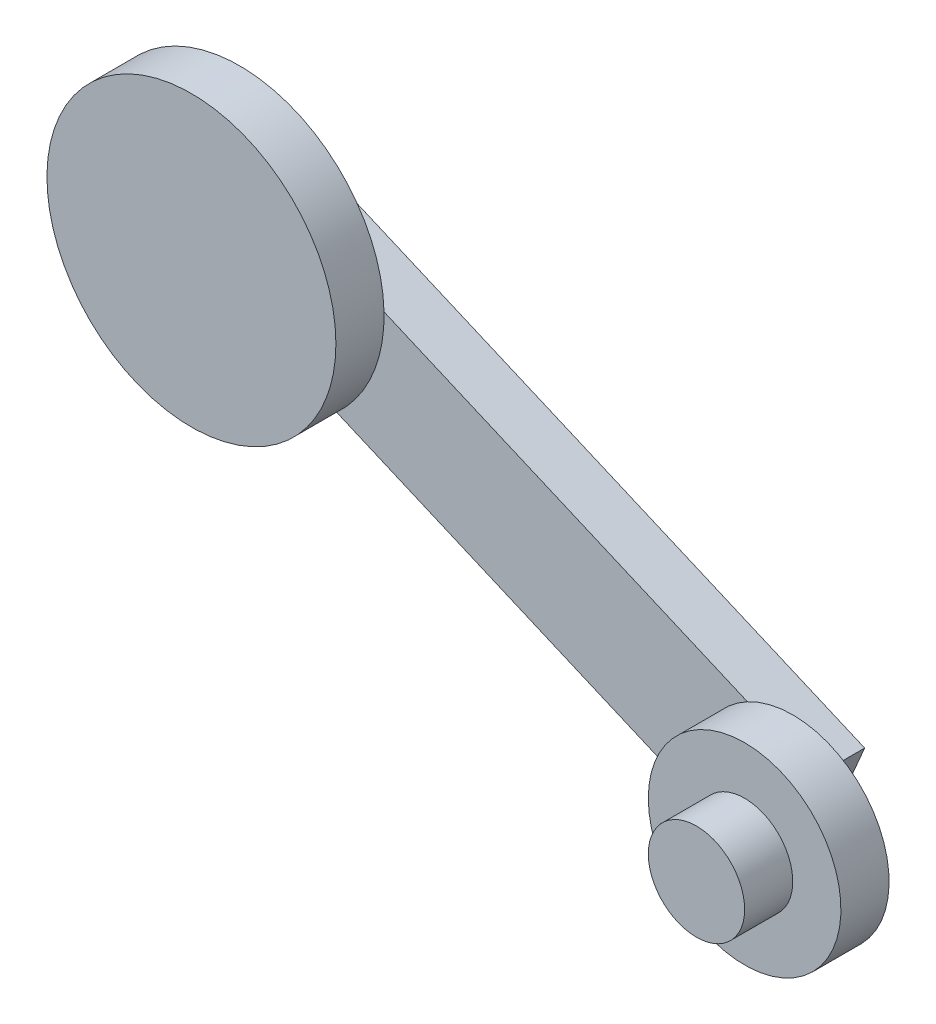
ISO-10303-21;
HEADER;
FILE_DESCRIPTION(('STEP AP214'),'2;1');
FILE_NAME('part.step','',(''),(''),'','','');
FILE_SCHEMA(('AUTOMOTIVE_DESIGN { 1 0 10303 214 1 1 1 1 }'));
ENDSEC;
DATA;
#1=APPLICATION_CONTEXT('core data for automotive mechanical design processes');
#2=APPLICATION_PROTOCOL_DEFINITION('international standard','automotive_design',2000,#1);
#3=PRODUCT_CONTEXT('',#1,'mechanical');
#4=PRODUCT('Part','Part','',(#3));
#5=PRODUCT_RELATED_PRODUCT_CATEGORY('part','',(#4));
#6=PRODUCT_DEFINITION_FORMATION('','',#4);
#7=PRODUCT_DEFINITION_CONTEXT('part definition',#1,'design');
#8=PRODUCT_DEFINITION('design','',#6,#7);
#9=PRODUCT_DEFINITION_SHAPE('','',#8);
#10=(LENGTH_UNIT() NAMED_UNIT(*) SI_UNIT(.MILLI.,.METRE.));
#11=(NAMED_UNIT(*) PLANE_ANGLE_UNIT() SI_UNIT($,.RADIAN.));
#12=(NAMED_UNIT(*) SI_UNIT($,.STERADIAN.) SOLID_ANGLE_UNIT());
#13=UNCERTAINTY_MEASURE_WITH_UNIT(LENGTH_MEASURE(1.E-05),#10,'distance_accuracy_value','');
#14=(GEOMETRIC_REPRESENTATION_CONTEXT(3) GLOBAL_UNCERTAINTY_ASSIGNED_CONTEXT((#13)) GLOBAL_UNIT_ASSIGNED_CONTEXT((#10,
#11,#12)) REPRESENTATION_CONTEXT('',''));
#15=CARTESIAN_POINT('',(0.,0.,0.));
#16=DIRECTION('',(0.,0.,1.));
#17=DIRECTION('',(1.,0.,0.));
#18=AXIS2_PLACEMENT_3D('',#15,#16,#17);
#19=CARTESIAN_POINT('',(0.,0.,2.));
#20=DIRECTION('',(0.,0.,-1.));
#21=DIRECTION('',(-1.,0.,0.));
#22=AXIS2_PLACEMENT_3D('',#19,#20,#21);
#23=CYLINDRICAL_SURFACE('',#22,2.);
#24=CARTESIAN_POINT('',(0.,0.,2.));
#25=DIRECTION('',(0.,0.,1.));
#26=DIRECTION('',(1.,0.,0.));
#27=AXIS2_PLACEMENT_3D('',#24,#25,#26);
#28=CIRCLE('',#27,2.);
#29=CARTESIAN_POINT('',(2.,0.,2.));
#30=VERTEX_POINT('',#29);
#31=EDGE_CURVE('E113',#30,#30,#28,.T.);
#32=ORIENTED_EDGE('',*,*,#31,.F.);
#33=EDGE_LOOP('',(#32));
#34=FACE_BOUND('',#33,.T.);
#35=CARTESIAN_POINT('',(0.,0.,0.));
#36=DIRECTION('',(0.,0.,-1.));
#37=DIRECTION('',(-1.,0.,0.));
#38=AXIS2_PLACEMENT_3D('',#35,#36,#37);
#39=CIRCLE('',#38,2.);
#40=CARTESIAN_POINT('',(-2.,0.,0.));
#41=VERTEX_POINT('',#40);
#42=EDGE_CURVE('E117',#41,#41,#39,.T.);
#43=ORIENTED_EDGE('',*,*,#42,.F.);
#44=EDGE_LOOP('',(#43));
#45=FACE_BOUND('',#44,.T.);
#46=ADVANCED_FACE('F33',(#34,#45),#23,.T.);
#47=CARTESIAN_POINT('',(0.,0.,2.));
#48=DIRECTION('',(0.,0.,1.));
#49=DIRECTION('',(1.,0.,0.));
#50=AXIS2_PLACEMENT_3D('',#47,#48,#49);
#51=PLANE('',#50);
#52=ORIENTED_EDGE('',*,*,#31,.T.);
#53=EDGE_LOOP('',(#52));
#54=FACE_BOUND('',#53,.T.);
#55=ADVANCED_FACE('F174',(#54),#51,.T.);
#56=CARTESIAN_POINT('',(0.,0.,-2.));
#57=DIRECTION('',(0.,0.,1.));
#58=DIRECTION('',(1.,0.,0.));
#59=AXIS2_PLACEMENT_3D('',#56,#57,#58);
#60=CYLINDRICAL_SURFACE('',#59,4.);
#61=CARTESIAN_POINT('',(0.,0.,-2.));
#62=DIRECTION('',(0.,0.,-1.));
#63=DIRECTION('',(-1.,0.,0.));
#64=AXIS2_PLACEMENT_3D('',#61,#62,#63);
#65=CIRCLE('',#64,4.);
#66=CARTESIAN_POINT('',(-1.8835550271514,3.52877038919971,-2.));
#67=VERTEX_POINT('',#66);
#68=CARTESIAN_POINT('',(-3.85533453990183,-1.06601856711783,-2.));
#69=VERTEX_POINT('',#68);
#70=EDGE_CURVE('E121',#67,#69,#65,.T.);
#71=ORIENTED_EDGE('',*,*,#70,.F.);
#72=EDGE_CURVE('E100',#69,#67,#65,.T.);
#73=ORIENTED_EDGE('',*,*,#72,.F.);
#74=EDGE_LOOP('',(#71,#73));
#75=FACE_BOUND('',#74,.T.);
#76=CARTESIAN_POINT('',(0.,0.,0.));
#77=DIRECTION('',(0.,0.,-1.));
#78=DIRECTION('',(-1.,0.,0.));
#79=AXIS2_PLACEMENT_3D('',#76,#77,#78);
#80=CIRCLE('',#79,4.);
#81=CARTESIAN_POINT('',(-4.,0.,0.));
#82=VERTEX_POINT('',#81);
#83=EDGE_CURVE('E124',#82,#82,#80,.T.);
#84=ORIENTED_EDGE('',*,*,#83,.T.);
#85=EDGE_LOOP('',(#84));
#86=FACE_BOUND('',#85,.T.);
#87=ADVANCED_FACE('F179',(#75,#86),#60,.T.);
#88=CARTESIAN_POINT('',(0.,0.,-2.));
#89=DIRECTION('',(0.,0.,-1.));
#90=DIRECTION('',(-1.,0.,0.));
#91=AXIS2_PLACEMENT_3D('',#88,#89,#90);
#92=PLANE('',#91);
#93=DIRECTION('',(-0.918957791263508,0.394355902550088,0.));
#94=VECTOR('',#93,1.);
#95=CARTESIAN_POINT('',(-23.9598345379629,7.56150308559342,-2.));
#96=LINE('',#95,#94);
#97=CARTESIAN_POINT('',(-0.985889756375223,-2.29739447815877,-2.));
#98=VERTEX_POINT('',#97);
#99=EDGE_CURVE('E54',#98,#69,#96,.T.);
#100=ORIENTED_EDGE('',*,*,#99,.F.);
#101=DIRECTION('',(-0.394355902550088,-0.918957791263508,0.));
#102=VECTOR('',#101,1.);
#103=CARTESIAN_POINT('',(0.98588975637522,2.29739447815877,-2.));
#104=LINE('',#103,#102);
#105=CARTESIAN_POINT('',(0.98588975637522,2.29739447815877,-2.));
#106=VERTEX_POINT('',#105);
#107=EDGE_CURVE('E110',#106,#98,#104,.T.);
#108=ORIENTED_EDGE('',*,*,#107,.F.);
#109=DIRECTION('',(0.918957791263508,-0.394355902550088,0.));
#110=VECTOR('',#109,1.);
#111=CARTESIAN_POINT('',(-21.9880550252125,12.156292041911,-2.));
#112=LINE('',#111,#110);
#113=EDGE_CURVE('E40',#67,#106,#112,.T.);
#114=ORIENTED_EDGE('',*,*,#113,.F.);
#115=ORIENTED_EDGE('',*,*,#70,.T.);
#116=EDGE_LOOP('',(#100,#108,#114,#115));
#117=FACE_BOUND('',#116,.T.);
#118=ADVANCED_FACE('F186',(#117),#92,.T.);
#119=CARTESIAN_POINT('',(0.,0.,0.));
#120=DIRECTION('',(0.,0.,-1.));
#121=DIRECTION('',(-1.,0.,0.));
#122=AXIS2_PLACEMENT_3D('',#119,#120,#121);
#123=PLANE('',#122);
#124=ORIENTED_EDGE('',*,*,#42,.T.);
#125=EDGE_LOOP('',(#124));
#126=FACE_BOUND('',#125,.T.);
#127=ORIENTED_EDGE('',*,*,#83,.F.);
#128=EDGE_LOOP('',(#127));
#129=FACE_BOUND('',#128,.T.);
#130=ADVANCED_FACE('F183',(#126,#129),#123,.F.);
#131=CARTESIAN_POINT('',(-21.9880550252125,12.156292041911,-4.));
#132=DIRECTION('',(0.918957791263508,-0.394355902550088,0.));
#133=DIRECTION('',(0.394355902550088,0.918957791263508,0.));
#134=AXIS2_PLACEMENT_3D('',#131,#132,#133);
#135=PLANE('',#134);
#136=DIRECTION('',(0.394355902550088,0.918957791263508,0.));
#137=VECTOR('',#136,1.);
#138=CARTESIAN_POINT('',(-21.9880550252125,12.156292041911,-2.));
#139=LINE('',#138,#137);
#140=CARTESIAN_POINT('',(-23.9598345379629,7.56150308559342,-2.));
#141=VERTEX_POINT('',#140);
#142=CARTESIAN_POINT('',(-21.9880550252125,12.156292041911,-2.));
#143=VERTEX_POINT('',#142);
#144=EDGE_CURVE('E104',#141,#143,#139,.T.);
#145=ORIENTED_EDGE('',*,*,#144,.T.);
#146=DIRECTION('',(0.,0.,1.));
#147=VECTOR('',#146,1.);
#148=CARTESIAN_POINT('',(-21.9880550252125,12.156292041911,-4.));
#149=LINE('',#148,#147);
#150=CARTESIAN_POINT('',(-21.9880550252125,12.156292041911,-4.));
#151=VERTEX_POINT('',#150);
#152=EDGE_CURVE('E108',#151,#143,#149,.T.);
#153=ORIENTED_EDGE('',*,*,#152,.F.);
#154=DIRECTION('',(0.394355902550088,0.918957791263508,0.));
#155=VECTOR('',#154,1.);
#156=CARTESIAN_POINT('',(-21.9880550252125,12.156292041911,-4.));
#157=LINE('',#156,#155);
#158=CARTESIAN_POINT('',(-23.9598345379629,7.56150308559342,-4.));
#159=VERTEX_POINT('',#158);
#160=EDGE_CURVE('E138',#159,#151,#157,.T.);
#161=ORIENTED_EDGE('',*,*,#160,.F.);
#162=DIRECTION('',(0.,0.,1.));
#163=VECTOR('',#162,1.);
#164=CARTESIAN_POINT('',(-23.9598345379629,7.56150308559342,-4.));
#165=LINE('',#164,#163);
#166=EDGE_CURVE('E134',#159,#141,#165,.T.);
#167=ORIENTED_EDGE('',*,*,#166,.T.);
#168=EDGE_LOOP('',(#145,#153,#161,#167));
#169=FACE_BOUND('',#168,.T.);
#170=ADVANCED_FACE('F149',(#169),#135,.F.);
#171=CARTESIAN_POINT('',(-21.9880550252125,12.156292041911,-4.));
#172=DIRECTION('',(-0.394355902550088,-0.918957791263509,0.));
#173=DIRECTION('',(0.918957791263509,-0.394355902550088,0.));
#174=AXIS2_PLACEMENT_3D('',#171,#172,#173);
#175=PLANE('',#174);
#176=CARTESIAN_POINT('',(-16.9757320300149,10.0053345360978,-2.));
#177=VERTEX_POINT('',#176);
#178=EDGE_CURVE('E91',#143,#177,#112,.T.);
#179=ORIENTED_EDGE('',*,*,#178,.T.);
#180=EDGE_CURVE('E98',#177,#67,#112,.T.);
#181=ORIENTED_EDGE('',*,*,#180,.T.);
#182=ORIENTED_EDGE('',*,*,#113,.T.);
#183=DIRECTION('',(0.,0.,1.));
#184=VECTOR('',#183,1.);
#185=CARTESIAN_POINT('',(0.98588975637522,2.29739447815877,-4.));
#186=LINE('',#185,#184);
#187=CARTESIAN_POINT('',(0.98588975637522,2.29739447815877,-4.));
#188=VERTEX_POINT('',#187);
#189=EDGE_CURVE('E129',#188,#106,#186,.T.);
#190=ORIENTED_EDGE('',*,*,#189,.F.);
#191=DIRECTION('',(0.918957791263508,-0.394355902550088,0.));
#192=VECTOR('',#191,1.);
#193=CARTESIAN_POINT('',(-21.9880550252125,12.156292041911,-4.));
#194=LINE('',#193,#192);
#195=EDGE_CURVE('E142',#151,#188,#194,.T.);
#196=ORIENTED_EDGE('',*,*,#195,.F.);
#197=ORIENTED_EDGE('',*,*,#152,.T.);
#198=EDGE_LOOP('',(#179,#181,#182,#190,#196,#197));
#199=FACE_BOUND('',#198,.T.);
#200=ADVANCED_FACE('F106',(#199),#175,.F.);
#201=CARTESIAN_POINT('',(0.98588975637522,2.29739447815877,-4.));
#202=DIRECTION('',(-0.918957791263508,0.394355902550088,0.));
#203=DIRECTION('',(-0.394355902550088,-0.918957791263508,0.));
#204=AXIS2_PLACEMENT_3D('',#201,#202,#203);
#205=PLANE('',#204);
#206=ORIENTED_EDGE('',*,*,#107,.T.);
#207=DIRECTION('',(0.,0.,1.));
#208=VECTOR('',#207,1.);
#209=CARTESIAN_POINT('',(-0.985889756375223,-2.29739447815877,-4.));
#210=LINE('',#209,#208);
#211=CARTESIAN_POINT('',(-0.985889756375223,-2.29739447815877,-4.));
#212=VERTEX_POINT('',#211);
#213=EDGE_CURVE('E131',#212,#98,#210,.T.);
#214=ORIENTED_EDGE('',*,*,#213,.F.);
#215=DIRECTION('',(-0.394355902550088,-0.918957791263508,0.));
#216=VECTOR('',#215,1.);
#217=CARTESIAN_POINT('',(0.98588975637522,2.29739447815877,-4.));
#218=LINE('',#217,#216);
#219=EDGE_CURVE('E153',#188,#212,#218,.T.);
#220=ORIENTED_EDGE('',*,*,#219,.F.);
#221=ORIENTED_EDGE('',*,*,#189,.T.);
#222=EDGE_LOOP('',(#206,#214,#220,#221));
#223=FACE_BOUND('',#222,.T.);
#224=ADVANCED_FACE('F203',(#223),#205,.F.);
#225=CARTESIAN_POINT('',(-23.9598345379629,7.56150308559342,-4.));
#226=DIRECTION('',(0.394355902550088,0.918957791263509,0.));
#227=DIRECTION('',(-0.918957791263509,0.394355902550088,0.));
#228=AXIS2_PLACEMENT_3D('',#225,#226,#227);
#229=PLANE('',#228);
#230=ORIENTED_EDGE('',*,*,#99,.T.);
#231=CARTESIAN_POINT('',(-18.9475115427654,5.41054557978029,-2.));
#232=VERTEX_POINT('',#231);
#233=EDGE_CURVE('E139',#69,#232,#96,.T.);
#234=ORIENTED_EDGE('',*,*,#233,.T.);
#235=EDGE_CURVE('E94',#232,#141,#96,.T.);
#236=ORIENTED_EDGE('',*,*,#235,.T.);
#237=ORIENTED_EDGE('',*,*,#166,.F.);
#238=DIRECTION('',(-0.918957791263508,0.394355902550088,0.));
#239=VECTOR('',#238,1.);
#240=CARTESIAN_POINT('',(-23.9598345379629,7.56150308559342,-4.));
#241=LINE('',#240,#239);
#242=EDGE_CURVE('E137',#212,#159,#241,.T.);
#243=ORIENTED_EDGE('',*,*,#242,.F.);
#244=ORIENTED_EDGE('',*,*,#213,.T.);
#245=EDGE_LOOP('',(#230,#234,#236,#237,#243,#244));
#246=FACE_BOUND('',#245,.T.);
#247=ADVANCED_FACE('F145',(#246),#229,.F.);
#248=CARTESIAN_POINT('',(0.,0.,-4.));
#249=DIRECTION('',(0.,0.,1.));
#250=DIRECTION('',(1.,0.,0.));
#251=AXIS2_PLACEMENT_3D('',#248,#249,#250);
#252=PLANE('',#251);
#253=ORIENTED_EDGE('',*,*,#160,.T.);
#254=ORIENTED_EDGE('',*,*,#195,.T.);
#255=ORIENTED_EDGE('',*,*,#219,.T.);
#256=ORIENTED_EDGE('',*,*,#242,.T.);
#257=EDGE_LOOP('',(#253,#254,#255,#256));
#258=FACE_BOUND('',#257,.T.);
#259=ADVANCED_FACE('F151',(#258),#252,.F.);
#260=CARTESIAN_POINT('',(0.,0.,-2.));
#261=DIRECTION('',(0.,0.,1.));
#262=DIRECTION('',(1.,0.,0.));
#263=AXIS2_PLACEMENT_3D('',#260,#261,#262);
#264=PLANE('',#263);
#265=ORIENTED_EDGE('',*,*,#180,.F.);
#266=CARTESIAN_POINT('',(-22.9739447815877,9.85889756375219,-2.));
#267=DIRECTION('',(0.,0.,1.));
#268=DIRECTION('',(1.,0.,0.));
#269=AXIS2_PLACEMENT_3D('',#266,#267,#268);
#270=CIRCLE('',#269,6.);
#271=EDGE_CURVE('E11',#177,#232,#270,.F.);
#272=ORIENTED_EDGE('',*,*,#271,.T.);
#273=ORIENTED_EDGE('',*,*,#233,.F.);
#274=ORIENTED_EDGE('',*,*,#72,.T.);
#275=EDGE_LOOP('',(#265,#272,#273,#274));
#276=FACE_BOUND('',#275,.T.);
#277=ADVANCED_FACE('F99',(#276),#264,.T.);
#278=CARTESIAN_POINT('',(-22.9739447815877,9.85889756375219,-2.));
#279=DIRECTION('',(0.,0.,1.));
#280=DIRECTION('',(1.,0.,0.));
#281=AXIS2_PLACEMENT_3D('',#278,#279,#280);
#282=PLANE('',#281);
#283=CARTESIAN_POINT('',(-22.9739447815877,9.85889756375219,-2.));
#284=DIRECTION('',(0.,0.,1.));
#285=DIRECTION('',(1.,0.,0.));
#286=AXIS2_PLACEMENT_3D('',#283,#284,#285);
#287=CIRCLE('',#286,6.);
#288=EDGE_CURVE('E46',#177,#232,#287,.T.);
#289=ORIENTED_EDGE('',*,*,#288,.F.);
#290=ORIENTED_EDGE('',*,*,#178,.F.);
#291=ORIENTED_EDGE('',*,*,#144,.F.);
#292=ORIENTED_EDGE('',*,*,#235,.F.);
#293=EDGE_LOOP('',(#289,#290,#291,#292));
#294=FACE_BOUND('',#293,.T.);
#295=ADVANCED_FACE('F89',(#294),#282,.F.);
#296=CARTESIAN_POINT('',(-22.9739447815877,9.85889756375219,0.));
#297=DIRECTION('',(0.,0.,-1.));
#298=DIRECTION('',(-1.,0.,0.));
#299=AXIS2_PLACEMENT_3D('',#296,#297,#298);
#300=CYLINDRICAL_SURFACE('',#299,6.);
#301=CARTESIAN_POINT('',(-22.9739447815877,9.85889756375219,0.));
#302=DIRECTION('',(0.,0.,1.));
#303=DIRECTION('',(1.,0.,0.));
#304=AXIS2_PLACEMENT_3D('',#301,#302,#303);
#305=CIRCLE('',#304,6.);
#306=CARTESIAN_POINT('',(-16.9739447815877,9.85889756375219,0.));
#307=VERTEX_POINT('',#306);
#308=EDGE_CURVE('E95',#307,#307,#305,.T.);
#309=ORIENTED_EDGE('',*,*,#308,.F.);
#310=EDGE_LOOP('',(#309));
#311=FACE_BOUND('',#310,.T.);
#312=ORIENTED_EDGE('',*,*,#288,.T.);
#313=ORIENTED_EDGE('',*,*,#271,.F.);
#314=EDGE_LOOP('',(#312,#313));
#315=FACE_BOUND('',#314,.T.);
#316=ADVANCED_FACE('F83',(#311,#315),#300,.T.);
#317=CARTESIAN_POINT('',(-22.9739447815877,9.85889756375219,0.));
#318=DIRECTION('',(0.,0.,1.));
#319=DIRECTION('',(1.,0.,0.));
#320=AXIS2_PLACEMENT_3D('',#317,#318,#319);
#321=PLANE('',#320);
#322=ORIENTED_EDGE('',*,*,#308,.T.);
#323=EDGE_LOOP('',(#322));
#324=FACE_BOUND('',#323,.T.);
#325=ADVANCED_FACE('F162',(#324),#321,.T.);
#326=CLOSED_SHELL('',(#46,#55,#87,#118,#130,#170,#200,#224,#247,#259,#277,#295,#316,#325));
#327=MANIFOLD_SOLID_BREP('B2',#326);
#328=ADVANCED_BREP_SHAPE_REPRESENTATION('',(#18,#327),#14);
#329=SHAPE_DEFINITION_REPRESENTATION(#9,#328);
ENDSEC;
END-ISO-10303-21;
